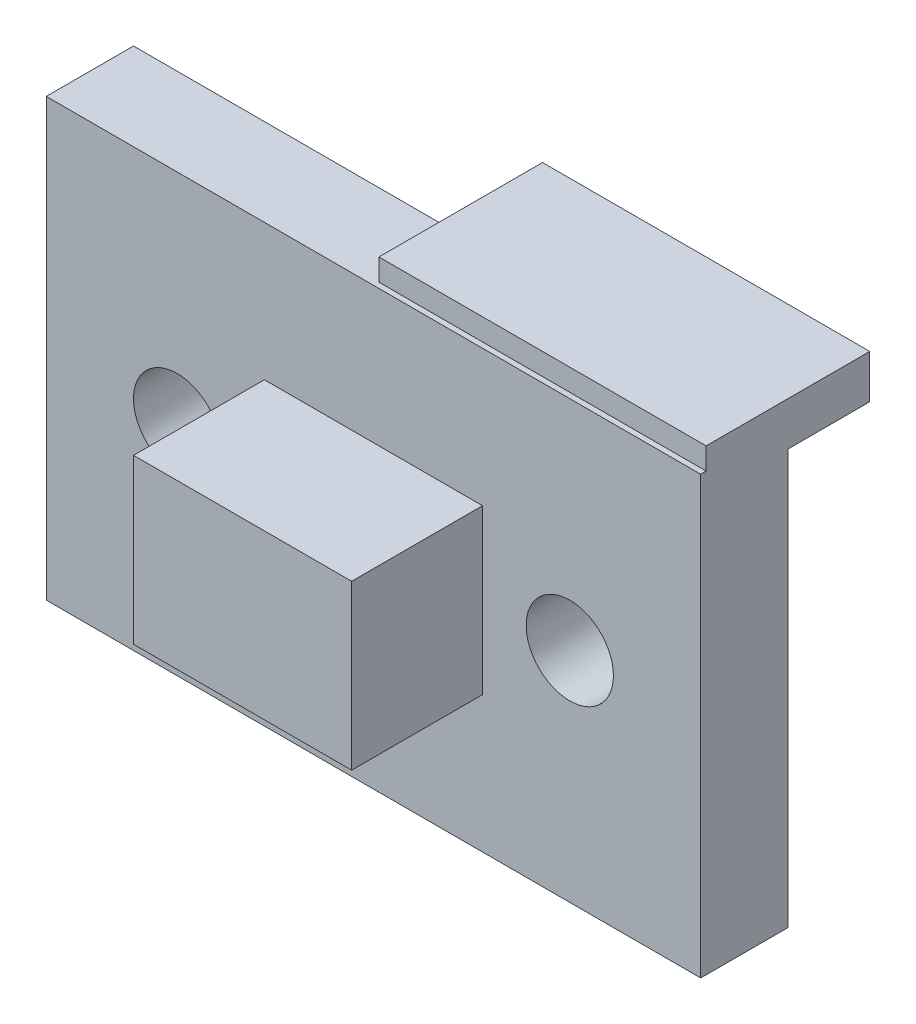
ISO-10303-21;
HEADER;
FILE_DESCRIPTION(('STEP AP214'),'2;1');
FILE_NAME('part.step','',(''),(''),'','','');
FILE_SCHEMA(('AUTOMOTIVE_DESIGN { 1 0 10303 214 1 1 1 1 }'));
ENDSEC;
DATA;
#1=APPLICATION_CONTEXT('core data for automotive mechanical design processes');
#2=APPLICATION_PROTOCOL_DEFINITION('international standard','automotive_design',2000,#1);
#3=PRODUCT_CONTEXT('',#1,'mechanical');
#4=PRODUCT('Part','Part','',(#3));
#5=PRODUCT_RELATED_PRODUCT_CATEGORY('part','',(#4));
#6=PRODUCT_DEFINITION_FORMATION('','',#4);
#7=PRODUCT_DEFINITION_CONTEXT('part definition',#1,'design');
#8=PRODUCT_DEFINITION('design','',#6,#7);
#9=PRODUCT_DEFINITION_SHAPE('','',#8);
#10=(LENGTH_UNIT() NAMED_UNIT(*) SI_UNIT(.MILLI.,.METRE.));
#11=(NAMED_UNIT(*) PLANE_ANGLE_UNIT() SI_UNIT($,.RADIAN.));
#12=(NAMED_UNIT(*) SI_UNIT($,.STERADIAN.) SOLID_ANGLE_UNIT());
#13=UNCERTAINTY_MEASURE_WITH_UNIT(LENGTH_MEASURE(1.E-05),#10,'distance_accuracy_value','');
#14=(GEOMETRIC_REPRESENTATION_CONTEXT(3) GLOBAL_UNCERTAINTY_ASSIGNED_CONTEXT((#13)) GLOBAL_UNIT_ASSIGNED_CONTEXT((#10,
#11,#12)) REPRESENTATION_CONTEXT('',''));
#15=CARTESIAN_POINT('',(0.,0.,0.));
#16=DIRECTION('',(0.,0.,1.));
#17=DIRECTION('',(1.,0.,0.));
#18=AXIS2_PLACEMENT_3D('',#15,#16,#17);
#19=CARTESIAN_POINT('',(0.,0.,20.));
#20=DIRECTION('',(0.,0.,1.));
#21=DIRECTION('',(1.,0.,0.));
#22=AXIS2_PLACEMENT_3D('',#19,#20,#21);
#23=PLANE('',#22);
#24=DIRECTION('',(1.,0.,0.));
#25=VECTOR('',#24,1.);
#26=CARTESIAN_POINT('',(-10.,-7.5,20.));
#27=LINE('',#26,#25);
#28=CARTESIAN_POINT('',(-10.,-7.5,20.));
#29=VERTEX_POINT('',#28);
#30=CARTESIAN_POINT('',(10.,-7.5,20.));
#31=VERTEX_POINT('',#30);
#32=EDGE_CURVE('E37',#29,#31,#27,.T.);
#33=ORIENTED_EDGE('',*,*,#32,.T.);
#34=DIRECTION('',(0.,1.,0.));
#35=VECTOR('',#34,1.);
#36=CARTESIAN_POINT('',(10.,-7.5,20.));
#37=LINE('',#36,#35);
#38=CARTESIAN_POINT('',(10.,7.5,20.));
#39=VERTEX_POINT('',#38);
#40=EDGE_CURVE('E112',#31,#39,#37,.T.);
#41=ORIENTED_EDGE('',*,*,#40,.T.);
#42=DIRECTION('',(-1.,0.,0.));
#43=VECTOR('',#42,1.);
#44=CARTESIAN_POINT('',(10.,7.5,20.));
#45=LINE('',#44,#43);
#46=CARTESIAN_POINT('',(-10.,7.5,20.));
#47=VERTEX_POINT('',#46);
#48=EDGE_CURVE('E141',#39,#47,#45,.T.);
#49=ORIENTED_EDGE('',*,*,#48,.T.);
#50=DIRECTION('',(0.,-1.,0.));
#51=VECTOR('',#50,1.);
#52=CARTESIAN_POINT('',(-10.,7.5,20.));
#53=LINE('',#52,#51);
#54=EDGE_CURVE('E114',#47,#29,#53,.T.);
#55=ORIENTED_EDGE('',*,*,#54,.T.);
#56=EDGE_LOOP('',(#33,#41,#49,#55));
#57=FACE_BOUND('',#56,.T.);
#58=ADVANCED_FACE('F16',(#57),#23,.T.);
#59=CARTESIAN_POINT('',(0.,18.,-7.5));
#60=DIRECTION('',(0.,0.,1.));
#61=DIRECTION('',(1.,0.,0.));
#62=AXIS2_PLACEMENT_3D('',#59,#60,#61);
#63=PLANE('',#62);
#64=DIRECTION('',(0.,1.,0.));
#65=VECTOR('',#64,1.);
#66=CARTESIAN_POINT('',(0.,18.,-7.5));
#67=LINE('',#66,#65);
#68=CARTESIAN_POINT('',(0.,18.,-7.5));
#69=VERTEX_POINT('',#68);
#70=CARTESIAN_POINT('',(0.,22.,-7.5));
#71=VERTEX_POINT('',#70);
#72=EDGE_CURVE('E250',#69,#71,#67,.T.);
#73=ORIENTED_EDGE('',*,*,#72,.T.);
#74=DIRECTION('',(1.,0.,0.));
#75=VECTOR('',#74,1.);
#76=CARTESIAN_POINT('',(0.,22.,-7.5));
#77=LINE('',#76,#75);
#78=CARTESIAN_POINT('',(30.,22.,-7.5));
#79=VERTEX_POINT('',#78);
#80=EDGE_CURVE('E10',#71,#79,#77,.T.);
#81=ORIENTED_EDGE('',*,*,#80,.T.);
#82=DIRECTION('',(0.,1.,0.));
#83=VECTOR('',#82,1.);
#84=CARTESIAN_POINT('',(30.,18.,-7.5));
#85=LINE('',#84,#83);
#86=CARTESIAN_POINT('',(30.,18.,-7.5));
#87=VERTEX_POINT('',#86);
#88=EDGE_CURVE('E180',#87,#79,#85,.T.);
#89=ORIENTED_EDGE('',*,*,#88,.F.);
#90=DIRECTION('',(1.,0.,0.));
#91=VECTOR('',#90,1.);
#92=CARTESIAN_POINT('',(0.,18.,-7.5));
#93=LINE('',#92,#91);
#94=EDGE_CURVE('E258',#69,#87,#93,.T.);
#95=ORIENTED_EDGE('',*,*,#94,.F.);
#96=EDGE_LOOP('',(#73,#81,#89,#95));
#97=FACE_BOUND('',#96,.T.);
#98=ADVANCED_FACE('F376',(#97),#63,.F.);
#99=CARTESIAN_POINT('',(0.,22.,-7.5));
#100=DIRECTION('',(0.,-1.,0.));
#101=DIRECTION('',(0.,0.,-1.));
#102=AXIS2_PLACEMENT_3D('',#99,#100,#101);
#103=PLANE('',#102);
#104=DIRECTION('',(0.,0.,1.));
#105=VECTOR('',#104,1.);
#106=CARTESIAN_POINT('',(0.,22.,-7.5));
#107=LINE('',#106,#105);
#108=CARTESIAN_POINT('',(0.,22.,7.5));
#109=VERTEX_POINT('',#108);
#110=EDGE_CURVE('E160',#71,#109,#107,.T.);
#111=ORIENTED_EDGE('',*,*,#110,.T.);
#112=DIRECTION('',(1.,0.,0.));
#113=VECTOR('',#112,1.);
#114=CARTESIAN_POINT('',(0.,22.,7.5));
#115=LINE('',#114,#113);
#116=CARTESIAN_POINT('',(30.,22.,7.5));
#117=VERTEX_POINT('',#116);
#118=EDGE_CURVE('E25',#109,#117,#115,.T.);
#119=ORIENTED_EDGE('',*,*,#118,.T.);
#120=DIRECTION('',(0.,0.,1.));
#121=VECTOR('',#120,1.);
#122=CARTESIAN_POINT('',(30.,22.,-7.5));
#123=LINE('',#122,#121);
#124=EDGE_CURVE('E157',#79,#117,#123,.T.);
#125=ORIENTED_EDGE('',*,*,#124,.F.);
#126=ORIENTED_EDGE('',*,*,#80,.F.);
#127=EDGE_LOOP('',(#111,#119,#125,#126));
#128=FACE_BOUND('',#127,.T.);
#129=ADVANCED_FACE('F155',(#128),#103,.F.);
#130=CARTESIAN_POINT('',(0.,22.,7.5));
#131=DIRECTION('',(0.,0.,-1.));
#132=DIRECTION('',(0.,-1.,0.));
#133=AXIS2_PLACEMENT_3D('',#130,#131,#132);
#134=PLANE('',#133);
#135=DIRECTION('',(1.,0.,0.));
#136=VECTOR('',#135,1.);
#137=CARTESIAN_POINT('',(15.,20.,7.5));
#138=LINE('',#137,#136);
#139=CARTESIAN_POINT('',(0.,20.,7.5));
#140=VERTEX_POINT('',#139);
#141=CARTESIAN_POINT('',(30.,20.,7.5));
#142=VERTEX_POINT('',#141);
#143=EDGE_CURVE('E170',#140,#142,#138,.T.);
#144=ORIENTED_EDGE('',*,*,#143,.T.);
#145=DIRECTION('',(0.,-1.,0.));
#146=VECTOR('',#145,1.);
#147=CARTESIAN_POINT('',(30.,22.,7.5));
#148=LINE('',#147,#146);
#149=EDGE_CURVE('E167',#117,#142,#148,.T.);
#150=ORIENTED_EDGE('',*,*,#149,.F.);
#151=ORIENTED_EDGE('',*,*,#118,.F.);
#152=DIRECTION('',(0.,-1.,0.));
#153=VECTOR('',#152,1.);
#154=CARTESIAN_POINT('',(0.,22.,7.5));
#155=LINE('',#154,#153);
#156=EDGE_CURVE('E245',#109,#140,#155,.T.);
#157=ORIENTED_EDGE('',*,*,#156,.T.);
#158=EDGE_LOOP('',(#144,#150,#151,#157));
#159=FACE_BOUND('',#158,.T.);
#160=ADVANCED_FACE('F168',(#159),#134,.F.);
#161=CARTESIAN_POINT('',(-10.,-7.5,0.));
#162=DIRECTION('',(0.,1.,0.));
#163=DIRECTION('',(1.,0.,0.));
#164=AXIS2_PLACEMENT_3D('',#161,#162,#163);
#165=PLANE('',#164);
#166=DIRECTION('',(0.,0.,1.));
#167=VECTOR('',#166,1.);
#168=CARTESIAN_POINT('',(10.,-7.5,0.));
#169=LINE('',#168,#167);
#170=CARTESIAN_POINT('',(10.,-7.5,8.));
#171=VERTEX_POINT('',#170);
#172=EDGE_CURVE('E119',#171,#31,#169,.T.);
#173=ORIENTED_EDGE('',*,*,#172,.T.);
#174=ORIENTED_EDGE('',*,*,#32,.F.);
#175=DIRECTION('',(0.,0.,1.));
#176=VECTOR('',#175,1.);
#177=CARTESIAN_POINT('',(-10.,-7.5,0.));
#178=LINE('',#177,#176);
#179=CARTESIAN_POINT('',(-10.,-7.5,8.));
#180=VERTEX_POINT('',#179);
#181=EDGE_CURVE('E144',#180,#29,#178,.T.);
#182=ORIENTED_EDGE('',*,*,#181,.F.);
#183=DIRECTION('',(-1.,0.,0.));
#184=VECTOR('',#183,1.);
#185=CARTESIAN_POINT('',(-5.,-7.5,8.));
#186=LINE('',#185,#184);
#187=EDGE_CURVE('E122',#171,#180,#186,.T.);
#188=ORIENTED_EDGE('',*,*,#187,.F.);
#189=EDGE_LOOP('',(#173,#174,#182,#188));
#190=FACE_BOUND('',#189,.T.);
#191=ADVANCED_FACE('F120',(#190),#165,.F.);
#192=CARTESIAN_POINT('',(-10.,7.5,0.));
#193=DIRECTION('',(1.,0.,0.));
#194=DIRECTION('',(0.,1.,0.));
#195=AXIS2_PLACEMENT_3D('',#192,#193,#194);
#196=PLANE('',#195);
#197=ORIENTED_EDGE('',*,*,#181,.T.);
#198=ORIENTED_EDGE('',*,*,#54,.F.);
#199=DIRECTION('',(0.,0.,1.));
#200=VECTOR('',#199,1.);
#201=CARTESIAN_POINT('',(-10.,7.5,0.));
#202=LINE('',#201,#200);
#203=CARTESIAN_POINT('',(-10.,7.5,8.));
#204=VERTEX_POINT('',#203);
#205=EDGE_CURVE('E127',#204,#47,#202,.T.);
#206=ORIENTED_EDGE('',*,*,#205,.F.);
#207=DIRECTION('',(0.,1.,0.));
#208=VECTOR('',#207,1.);
#209=CARTESIAN_POINT('',(-10.,3.75,8.));
#210=LINE('',#209,#208);
#211=EDGE_CURVE('E204',#180,#204,#210,.T.);
#212=ORIENTED_EDGE('',*,*,#211,.F.);
#213=EDGE_LOOP('',(#197,#198,#206,#212));
#214=FACE_BOUND('',#213,.T.);
#215=ADVANCED_FACE('F389',(#214),#196,.F.);
#216=CARTESIAN_POINT('',(10.,7.5,0.));
#217=DIRECTION('',(0.,-1.,0.));
#218=DIRECTION('',(0.,0.,-1.));
#219=AXIS2_PLACEMENT_3D('',#216,#217,#218);
#220=PLANE('',#219);
#221=ORIENTED_EDGE('',*,*,#205,.T.);
#222=ORIENTED_EDGE('',*,*,#48,.F.);
#223=DIRECTION('',(0.,0.,1.));
#224=VECTOR('',#223,1.);
#225=CARTESIAN_POINT('',(10.,7.5,0.));
#226=LINE('',#225,#224);
#227=CARTESIAN_POINT('',(10.,7.5,8.));
#228=VERTEX_POINT('',#227);
#229=EDGE_CURVE('E130',#228,#39,#226,.T.);
#230=ORIENTED_EDGE('',*,*,#229,.F.);
#231=DIRECTION('',(1.,0.,0.));
#232=VECTOR('',#231,1.);
#233=CARTESIAN_POINT('',(5.,7.5,8.));
#234=LINE('',#233,#232);
#235=EDGE_CURVE('E199',#204,#228,#234,.T.);
#236=ORIENTED_EDGE('',*,*,#235,.F.);
#237=EDGE_LOOP('',(#221,#222,#230,#236));
#238=FACE_BOUND('',#237,.T.);
#239=ADVANCED_FACE('F393',(#238),#220,.F.);
#240=CARTESIAN_POINT('',(10.,-7.5,0.));
#241=DIRECTION('',(-1.,0.,0.));
#242=DIRECTION('',(0.,0.,1.));
#243=AXIS2_PLACEMENT_3D('',#240,#241,#242);
#244=PLANE('',#243);
#245=ORIENTED_EDGE('',*,*,#229,.T.);
#246=ORIENTED_EDGE('',*,*,#40,.F.);
#247=ORIENTED_EDGE('',*,*,#172,.F.);
#248=DIRECTION('',(0.,-1.,0.));
#249=VECTOR('',#248,1.);
#250=CARTESIAN_POINT('',(10.,-3.75,8.));
#251=LINE('',#250,#249);
#252=EDGE_CURVE('E206',#228,#171,#251,.T.);
#253=ORIENTED_EDGE('',*,*,#252,.F.);
#254=EDGE_LOOP('',(#245,#246,#247,#253));
#255=FACE_BOUND('',#254,.T.);
#256=ADVANCED_FACE('F129',(#255),#244,.F.);
#257=CARTESIAN_POINT('',(18.,0.,0.));
#258=DIRECTION('',(0.,0.,-1.));
#259=DIRECTION('',(1.,0.,0.));
#260=AXIS2_PLACEMENT_3D('',#257,#258,#259);
#261=CYLINDRICAL_SURFACE('',#260,4.);
#262=CARTESIAN_POINT('',(18.,0.,0.));
#263=DIRECTION('',(0.,0.,1.));
#264=DIRECTION('',(1.,0.,0.));
#265=AXIS2_PLACEMENT_3D('',#262,#263,#264);
#266=CIRCLE('',#265,4.);
#267=CARTESIAN_POINT('',(22.,0.,0.));
#268=VERTEX_POINT('',#267);
#269=EDGE_CURVE('E222',#268,#268,#266,.T.);
#270=ORIENTED_EDGE('',*,*,#269,.F.);
#271=DIRECTION('',(0.,0.,1.));
#272=VECTOR('',#271,1.);
#273=CARTESIAN_POINT('',(22.,0.,0.));
#274=LINE('',#273,#272);
#275=CARTESIAN_POINT('',(22.,0.,8.));
#276=VERTEX_POINT('',#275);
#277=EDGE_CURVE('E135',#268,#276,#274,.T.);
#278=ORIENTED_EDGE('',*,*,#277,.T.);
#279=CARTESIAN_POINT('',(18.,0.,8.));
#280=DIRECTION('',(0.,0.,-1.));
#281=DIRECTION('',(1.,0.,0.));
#282=AXIS2_PLACEMENT_3D('',#279,#280,#281);
#283=CIRCLE('',#282,4.);
#284=EDGE_CURVE('E203',#276,#276,#283,.T.);
#285=ORIENTED_EDGE('',*,*,#284,.F.);
#286=ORIENTED_EDGE('',*,*,#277,.F.);
#287=EDGE_LOOP('',(#270,#278,#285,#286));
#288=FACE_BOUND('',#287,.T.);
#289=ADVANCED_FACE('F267',(#288),#261,.F.);
#290=CARTESIAN_POINT('',(-18.,0.,0.));
#291=DIRECTION('',(0.,0.,-1.));
#292=DIRECTION('',(1.,0.,0.));
#293=AXIS2_PLACEMENT_3D('',#290,#291,#292);
#294=CYLINDRICAL_SURFACE('',#293,4.);
#295=CARTESIAN_POINT('',(-18.,0.,0.));
#296=DIRECTION('',(0.,0.,1.));
#297=DIRECTION('',(1.,0.,0.));
#298=AXIS2_PLACEMENT_3D('',#295,#296,#297);
#299=CIRCLE('',#298,4.);
#300=CARTESIAN_POINT('',(-14.,0.,0.));
#301=VERTEX_POINT('',#300);
#302=EDGE_CURVE('E218',#301,#301,#299,.T.);
#303=ORIENTED_EDGE('',*,*,#302,.F.);
#304=DIRECTION('',(0.,0.,1.));
#305=VECTOR('',#304,1.);
#306=CARTESIAN_POINT('',(-14.,0.,0.));
#307=LINE('',#306,#305);
#308=CARTESIAN_POINT('',(-14.,0.,8.));
#309=VERTEX_POINT('',#308);
#310=EDGE_CURVE('E259',#301,#309,#307,.T.);
#311=ORIENTED_EDGE('',*,*,#310,.T.);
#312=CARTESIAN_POINT('',(-18.,0.,8.));
#313=DIRECTION('',(0.,0.,-1.));
#314=DIRECTION('',(1.,0.,0.));
#315=AXIS2_PLACEMENT_3D('',#312,#313,#314);
#316=CIRCLE('',#315,4.);
#317=EDGE_CURVE('E230',#309,#309,#316,.T.);
#318=ORIENTED_EDGE('',*,*,#317,.F.);
#319=ORIENTED_EDGE('',*,*,#310,.F.);
#320=EDGE_LOOP('',(#303,#311,#318,#319));
#321=FACE_BOUND('',#320,.T.);
#322=ADVANCED_FACE('F397',(#321),#294,.F.);
#323=CARTESIAN_POINT('',(0.,18.,7.5));
#324=DIRECTION('',(0.,1.,0.));
#325=DIRECTION('',(1.,0.,0.));
#326=AXIS2_PLACEMENT_3D('',#323,#324,#325);
#327=PLANE('',#326);
#328=ORIENTED_EDGE('',*,*,#94,.T.);
#329=DIRECTION('',(0.,0.,-1.));
#330=VECTOR('',#329,1.);
#331=CARTESIAN_POINT('',(30.,18.,7.5));
#332=LINE('',#331,#330);
#333=CARTESIAN_POINT('',(30.,18.,0.));
#334=VERTEX_POINT('',#333);
#335=EDGE_CURVE('E186',#334,#87,#332,.T.);
#336=ORIENTED_EDGE('',*,*,#335,.F.);
#337=DIRECTION('',(-1.,0.,0.));
#338=VECTOR('',#337,1.);
#339=CARTESIAN_POINT('',(0.,18.,0.));
#340=LINE('',#339,#338);
#341=CARTESIAN_POINT('',(0.,18.,0.));
#342=VERTEX_POINT('',#341);
#343=EDGE_CURVE('E211',#334,#342,#340,.T.);
#344=ORIENTED_EDGE('',*,*,#343,.T.);
#345=DIRECTION('',(0.,0.,-1.));
#346=VECTOR('',#345,1.);
#347=CARTESIAN_POINT('',(0.,18.,7.5));
#348=LINE('',#347,#346);
#349=EDGE_CURVE('E254',#342,#69,#348,.T.);
#350=ORIENTED_EDGE('',*,*,#349,.T.);
#351=EDGE_LOOP('',(#328,#336,#344,#350));
#352=FACE_BOUND('',#351,.T.);
#353=ADVANCED_FACE('F331',(#352),#327,.F.);
#354=CARTESIAN_POINT('',(0.,20.,0.));
#355=DIRECTION('',(1.,0.,0.));
#356=DIRECTION('',(0.,1.,0.));
#357=AXIS2_PLACEMENT_3D('',#354,#355,#356);
#358=PLANE('',#357);
#359=DIRECTION('',(0.,1.,0.));
#360=VECTOR('',#359,1.);
#361=CARTESIAN_POINT('',(0.,10.,0.));
#362=LINE('',#361,#360);
#363=CARTESIAN_POINT('',(0.,20.,0.));
#364=VERTEX_POINT('',#363);
#365=EDGE_CURVE('E193',#342,#364,#362,.T.);
#366=ORIENTED_EDGE('',*,*,#365,.T.);
#367=DIRECTION('',(0.,0.,1.));
#368=VECTOR('',#367,1.);
#369=CARTESIAN_POINT('',(0.,20.,0.));
#370=LINE('',#369,#368);
#371=EDGE_CURVE('E242',#364,#140,#370,.T.);
#372=ORIENTED_EDGE('',*,*,#371,.T.);
#373=ORIENTED_EDGE('',*,*,#156,.F.);
#374=ORIENTED_EDGE('',*,*,#110,.F.);
#375=ORIENTED_EDGE('',*,*,#72,.F.);
#376=ORIENTED_EDGE('',*,*,#349,.F.);
#377=EDGE_LOOP('',(#366,#372,#373,#374,#375,#376));
#378=FACE_BOUND('',#377,.T.);
#379=ADVANCED_FACE('F402',(#378),#358,.F.);
#380=CARTESIAN_POINT('',(30.,20.,0.));
#381=DIRECTION('',(0.,-1.,0.));
#382=DIRECTION('',(0.,0.,-1.));
#383=AXIS2_PLACEMENT_3D('',#380,#381,#382);
#384=PLANE('',#383);
#385=ORIENTED_EDGE('',*,*,#371,.F.);
#386=DIRECTION('',(-1.,0.,0.));
#387=VECTOR('',#386,1.);
#388=CARTESIAN_POINT('',(30.,20.,0.));
#389=LINE('',#388,#387);
#390=CARTESIAN_POINT('',(-30.,20.,0.));
#391=VERTEX_POINT('',#390);
#392=EDGE_CURVE('E190',#364,#391,#389,.T.);
#393=ORIENTED_EDGE('',*,*,#392,.T.);
#394=DIRECTION('',(0.,0.,1.));
#395=VECTOR('',#394,1.);
#396=CARTESIAN_POINT('',(-30.,20.,0.));
#397=LINE('',#396,#395);
#398=CARTESIAN_POINT('',(-30.,20.,8.));
#399=VERTEX_POINT('',#398);
#400=EDGE_CURVE('E318',#391,#399,#397,.T.);
#401=ORIENTED_EDGE('',*,*,#400,.T.);
#402=DIRECTION('',(-1.,0.,0.));
#403=VECTOR('',#402,1.);
#404=CARTESIAN_POINT('',(30.,20.,8.));
#405=LINE('',#404,#403);
#406=CARTESIAN_POINT('',(30.,20.,8.));
#407=VERTEX_POINT('',#406);
#408=EDGE_CURVE('E226',#407,#399,#405,.T.);
#409=ORIENTED_EDGE('',*,*,#408,.F.);
#410=DIRECTION('',(0.,0.,1.));
#411=VECTOR('',#410,1.);
#412=CARTESIAN_POINT('',(30.,20.,0.));
#413=LINE('',#412,#411);
#414=EDGE_CURVE('E175',#142,#407,#413,.T.);
#415=ORIENTED_EDGE('',*,*,#414,.F.);
#416=ORIENTED_EDGE('',*,*,#143,.F.);
#417=EDGE_LOOP('',(#385,#393,#401,#409,#415,#416));
#418=FACE_BOUND('',#417,.T.);
#419=ADVANCED_FACE('F273',(#418),#384,.F.);
#420=CARTESIAN_POINT('',(0.,0.,8.));
#421=DIRECTION('',(0.,0.,1.));
#422=DIRECTION('',(1.,0.,0.));
#423=AXIS2_PLACEMENT_3D('',#420,#421,#422);
#424=PLANE('',#423);
#425=ORIENTED_EDGE('',*,*,#284,.T.);
#426=EDGE_LOOP('',(#425));
#427=FACE_BOUND('',#426,.T.);
#428=ORIENTED_EDGE('',*,*,#252,.T.);
#429=ORIENTED_EDGE('',*,*,#187,.T.);
#430=ORIENTED_EDGE('',*,*,#211,.T.);
#431=ORIENTED_EDGE('',*,*,#235,.T.);
#432=EDGE_LOOP('',(#428,#429,#430,#431));
#433=FACE_BOUND('',#432,.T.);
#434=ORIENTED_EDGE('',*,*,#317,.T.);
#435=EDGE_LOOP('',(#434));
#436=FACE_BOUND('',#435,.T.);
#437=DIRECTION('',(1.,0.,0.));
#438=VECTOR('',#437,1.);
#439=CARTESIAN_POINT('',(-30.,-20.,8.));
#440=LINE('',#439,#438);
#441=CARTESIAN_POINT('',(-30.,-20.,8.));
#442=VERTEX_POINT('',#441);
#443=CARTESIAN_POINT('',(30.,-20.,8.));
#444=VERTEX_POINT('',#443);
#445=EDGE_CURVE('E282',#442,#444,#440,.T.);
#446=ORIENTED_EDGE('',*,*,#445,.T.);
#447=DIRECTION('',(0.,1.,0.));
#448=VECTOR('',#447,1.);
#449=CARTESIAN_POINT('',(30.,-20.,8.));
#450=LINE('',#449,#448);
#451=EDGE_CURVE('E195',#444,#407,#450,.T.);
#452=ORIENTED_EDGE('',*,*,#451,.T.);
#453=ORIENTED_EDGE('',*,*,#408,.T.);
#454=DIRECTION('',(0.,-1.,0.));
#455=VECTOR('',#454,1.);
#456=CARTESIAN_POINT('',(-30.,20.,8.));
#457=LINE('',#456,#455);
#458=EDGE_CURVE('E287',#399,#442,#457,.T.);
#459=ORIENTED_EDGE('',*,*,#458,.T.);
#460=EDGE_LOOP('',(#446,#452,#453,#459));
#461=FACE_BOUND('',#460,.T.);
#462=ADVANCED_FACE('F269',(#427,#433,#436,#461),#424,.T.);
#463=CARTESIAN_POINT('',(0.,0.,0.));
#464=DIRECTION('',(0.,0.,1.));
#465=DIRECTION('',(1.,0.,0.));
#466=AXIS2_PLACEMENT_3D('',#463,#464,#465);
#467=PLANE('',#466);
#468=ORIENTED_EDGE('',*,*,#269,.T.);
#469=EDGE_LOOP('',(#468));
#470=FACE_BOUND('',#469,.T.);
#471=ORIENTED_EDGE('',*,*,#302,.T.);
#472=EDGE_LOOP('',(#471));
#473=FACE_BOUND('',#472,.T.);
#474=ORIENTED_EDGE('',*,*,#392,.F.);
#475=ORIENTED_EDGE('',*,*,#365,.F.);
#476=ORIENTED_EDGE('',*,*,#343,.F.);
#477=DIRECTION('',(0.,1.,0.));
#478=VECTOR('',#477,1.);
#479=CARTESIAN_POINT('',(30.,-20.,0.));
#480=LINE('',#479,#478);
#481=CARTESIAN_POINT('',(30.,-20.,0.));
#482=VERTEX_POINT('',#481);
#483=EDGE_CURVE('E194',#482,#334,#480,.T.);
#484=ORIENTED_EDGE('',*,*,#483,.F.);
#485=DIRECTION('',(1.,0.,0.));
#486=VECTOR('',#485,1.);
#487=CARTESIAN_POINT('',(-30.,-20.,0.));
#488=LINE('',#487,#486);
#489=CARTESIAN_POINT('',(-30.,-20.,0.));
#490=VERTEX_POINT('',#489);
#491=EDGE_CURVE('E302',#490,#482,#488,.T.);
#492=ORIENTED_EDGE('',*,*,#491,.F.);
#493=DIRECTION('',(0.,-1.,0.));
#494=VECTOR('',#493,1.);
#495=CARTESIAN_POINT('',(-30.,20.,0.));
#496=LINE('',#495,#494);
#497=EDGE_CURVE('E315',#391,#490,#496,.T.);
#498=ORIENTED_EDGE('',*,*,#497,.F.);
#499=EDGE_LOOP('',(#474,#475,#476,#484,#492,#498));
#500=FACE_BOUND('',#499,.T.);
#501=ADVANCED_FACE('F272',(#470,#473,#500),#467,.F.);
#502=CARTESIAN_POINT('',(30.,-20.,0.));
#503=DIRECTION('',(-1.,0.,0.));
#504=DIRECTION('',(0.,0.,1.));
#505=AXIS2_PLACEMENT_3D('',#502,#503,#504);
#506=PLANE('',#505);
#507=ORIENTED_EDGE('',*,*,#335,.T.);
#508=ORIENTED_EDGE('',*,*,#88,.T.);
#509=ORIENTED_EDGE('',*,*,#124,.T.);
#510=ORIENTED_EDGE('',*,*,#149,.T.);
#511=ORIENTED_EDGE('',*,*,#414,.T.);
#512=ORIENTED_EDGE('',*,*,#451,.F.);
#513=DIRECTION('',(0.,0.,1.));
#514=VECTOR('',#513,1.);
#515=CARTESIAN_POINT('',(30.,-20.,0.));
#516=LINE('',#515,#514);
#517=EDGE_CURVE('E296',#482,#444,#516,.T.);
#518=ORIENTED_EDGE('',*,*,#517,.F.);
#519=ORIENTED_EDGE('',*,*,#483,.T.);
#520=EDGE_LOOP('',(#507,#508,#509,#510,#511,#512,#518,#519));
#521=FACE_BOUND('',#520,.T.);
#522=ADVANCED_FACE('F178',(#521),#506,.F.);
#523=CARTESIAN_POINT('',(-30.,20.,0.));
#524=DIRECTION('',(1.,0.,0.));
#525=DIRECTION('',(0.,1.,0.));
#526=AXIS2_PLACEMENT_3D('',#523,#524,#525);
#527=PLANE('',#526);
#528=ORIENTED_EDGE('',*,*,#497,.T.);
#529=DIRECTION('',(0.,0.,1.));
#530=VECTOR('',#529,1.);
#531=CARTESIAN_POINT('',(-30.,-20.,0.));
#532=LINE('',#531,#530);
#533=EDGE_CURVE('E295',#490,#442,#532,.T.);
#534=ORIENTED_EDGE('',*,*,#533,.T.);
#535=ORIENTED_EDGE('',*,*,#458,.F.);
#536=ORIENTED_EDGE('',*,*,#400,.F.);
#537=EDGE_LOOP('',(#528,#534,#535,#536));
#538=FACE_BOUND('',#537,.T.);
#539=ADVANCED_FACE('F363',(#538),#527,.F.);
#540=CARTESIAN_POINT('',(-30.,-20.,0.));
#541=DIRECTION('',(0.,1.,0.));
#542=DIRECTION('',(1.,0.,0.));
#543=AXIS2_PLACEMENT_3D('',#540,#541,#542);
#544=PLANE('',#543);
#545=ORIENTED_EDGE('',*,*,#491,.T.);
#546=ORIENTED_EDGE('',*,*,#517,.T.);
#547=ORIENTED_EDGE('',*,*,#445,.F.);
#548=ORIENTED_EDGE('',*,*,#533,.F.);
#549=EDGE_LOOP('',(#545,#546,#547,#548));
#550=FACE_BOUND('',#549,.T.);
#551=ADVANCED_FACE('F300',(#550),#544,.F.);
#552=CLOSED_SHELL('',(#58,#98,#129,#160,#191,#215,#239,#256,#289,#322,#353,#379,#419,#462,#501,
#522,#539,#551));
#553=MANIFOLD_SOLID_BREP('B1',#552);
#554=ADVANCED_BREP_SHAPE_REPRESENTATION('',(#18,#553),#14);
#555=SHAPE_DEFINITION_REPRESENTATION(#9,#554);
ENDSEC;
END-ISO-10303-21;
